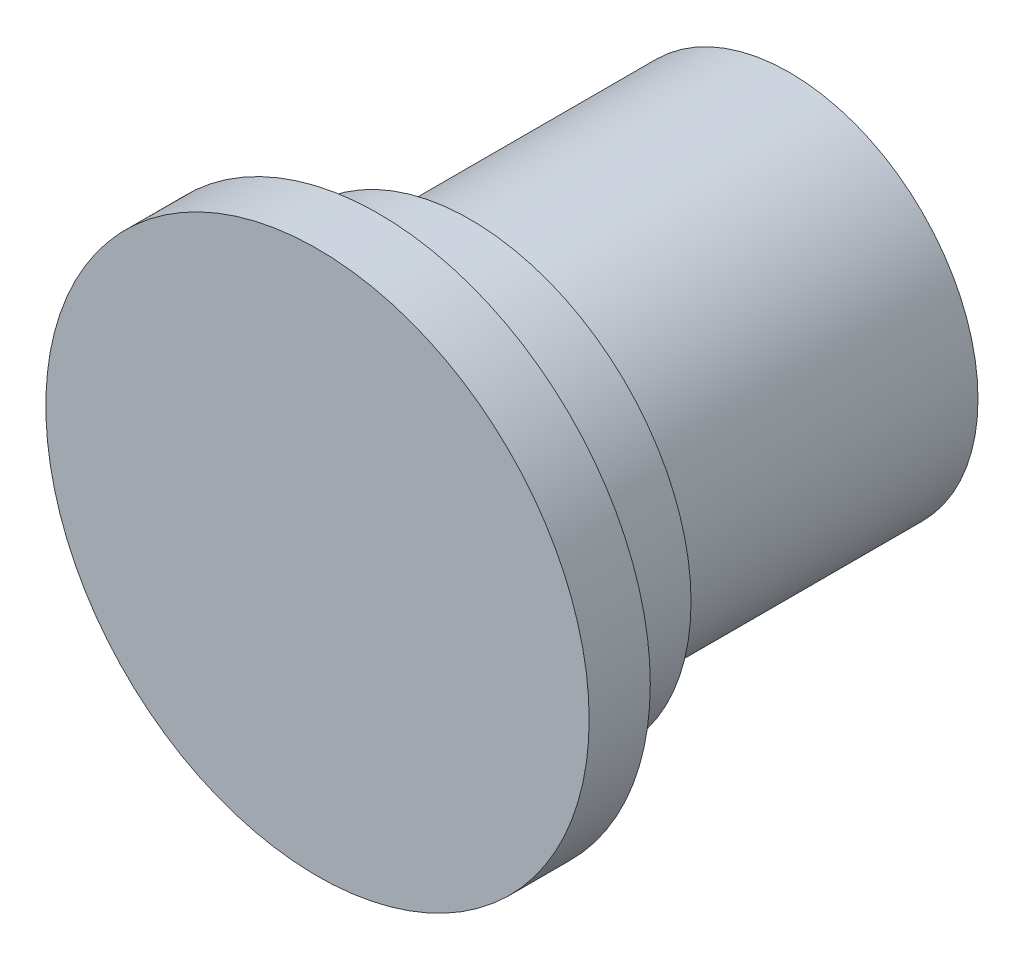
ISO-10303-21;
HEADER;
FILE_DESCRIPTION(('STEP AP214'),'2;1');
FILE_NAME('part.step','',(''),(''),'','','');
FILE_SCHEMA(('AUTOMOTIVE_DESIGN { 1 0 10303 214 1 1 1 1 }'));
ENDSEC;
DATA;
#1=APPLICATION_CONTEXT('core data for automotive mechanical design processes');
#2=APPLICATION_PROTOCOL_DEFINITION('international standard','automotive_design',2000,#1);
#3=PRODUCT_CONTEXT('',#1,'mechanical');
#4=PRODUCT('Part','Part','',(#3));
#5=PRODUCT_RELATED_PRODUCT_CATEGORY('part','',(#4));
#6=PRODUCT_DEFINITION_FORMATION('','',#4);
#7=PRODUCT_DEFINITION_CONTEXT('part definition',#1,'design');
#8=PRODUCT_DEFINITION('design','',#6,#7);
#9=PRODUCT_DEFINITION_SHAPE('','',#8);
#10=(LENGTH_UNIT() NAMED_UNIT(*) SI_UNIT(.MILLI.,.METRE.));
#11=(NAMED_UNIT(*) PLANE_ANGLE_UNIT() SI_UNIT($,.RADIAN.));
#12=(NAMED_UNIT(*) SI_UNIT($,.STERADIAN.) SOLID_ANGLE_UNIT());
#13=UNCERTAINTY_MEASURE_WITH_UNIT(LENGTH_MEASURE(1.E-05),#10,'distance_accuracy_value','');
#14=(GEOMETRIC_REPRESENTATION_CONTEXT(3) GLOBAL_UNCERTAINTY_ASSIGNED_CONTEXT((#13)) GLOBAL_UNIT_ASSIGNED_CONTEXT((#10,
#11,#12)) REPRESENTATION_CONTEXT('',''));
#15=CARTESIAN_POINT('',(0.,0.,0.));
#16=DIRECTION('',(0.,0.,1.));
#17=DIRECTION('',(1.,0.,0.));
#18=AXIS2_PLACEMENT_3D('',#15,#16,#17);
#19=CARTESIAN_POINT('',(0.,0.,-4.5));
#20=DIRECTION('',(0.,0.,-1.));
#21=DIRECTION('',(-1.,0.,0.));
#22=AXIS2_PLACEMENT_3D('',#19,#20,#21);
#23=PLANE('',#22);
#24=CARTESIAN_POINT('',(0.,0.,-4.5));
#25=DIRECTION('',(0.,0.,-1.));
#26=DIRECTION('',(-1.,0.,0.));
#27=AXIS2_PLACEMENT_3D('',#24,#25,#26);
#28=CIRCLE('',#27,6.5);
#29=CARTESIAN_POINT('',(6.5,0.,-4.5));
#30=VERTEX_POINT('',#29);
#31=EDGE_CURVE('E47',#30,#30,#28,.T.);
#32=ORIENTED_EDGE('',*,*,#31,.T.);
#33=EDGE_LOOP('',(#32));
#34=FACE_BOUND('',#33,.T.);
#35=CARTESIAN_POINT('',(0.,0.,-4.5));
#36=DIRECTION('',(0.,0.,-1.));
#37=DIRECTION('',(-1.,0.,0.));
#38=AXIS2_PLACEMENT_3D('',#35,#36,#37);
#39=CIRCLE('',#38,5.55);
#40=CARTESIAN_POINT('',(-5.55,0.,-4.5));
#41=VERTEX_POINT('',#40);
#42=EDGE_CURVE('E52',#41,#41,#39,.T.);
#43=ORIENTED_EDGE('',*,*,#42,.F.);
#44=EDGE_LOOP('',(#43));
#45=FACE_BOUND('',#44,.T.);
#46=ADVANCED_FACE('F31',(#34,#45),#23,.T.);
#47=CARTESIAN_POINT('',(0.,0.,-1.8));
#48=DIRECTION('',(0.,0.,1.));
#49=DIRECTION('',(1.,0.,0.));
#50=AXIS2_PLACEMENT_3D('',#47,#48,#49);
#51=PLANE('',#50);
#52=CARTESIAN_POINT('',(0.,0.,-1.8));
#53=DIRECTION('',(0.,0.,1.));
#54=DIRECTION('',(1.,0.,0.));
#55=AXIS2_PLACEMENT_3D('',#52,#53,#54);
#56=CIRCLE('',#55,8.);
#57=CARTESIAN_POINT('',(8.,0.,-1.8));
#58=VERTEX_POINT('',#57);
#59=EDGE_CURVE('E38',#58,#58,#56,.T.);
#60=ORIENTED_EDGE('',*,*,#59,.F.);
#61=EDGE_LOOP('',(#60));
#62=FACE_BOUND('',#61,.T.);
#63=CARTESIAN_POINT('',(0.,0.,-1.8));
#64=DIRECTION('',(0.,0.,1.));
#65=DIRECTION('',(1.,0.,0.));
#66=AXIS2_PLACEMENT_3D('',#63,#64,#65);
#67=CIRCLE('',#66,6.5);
#68=CARTESIAN_POINT('',(6.5,0.,-1.8));
#69=VERTEX_POINT('',#68);
#70=EDGE_CURVE('E10',#69,#69,#67,.F.);
#71=ORIENTED_EDGE('',*,*,#70,.F.);
#72=EDGE_LOOP('',(#71));
#73=FACE_BOUND('',#72,.T.);
#74=ADVANCED_FACE('F68',(#62,#73),#51,.F.);
#75=CARTESIAN_POINT('',(0.,0.,-1.8));
#76=DIRECTION('',(0.,0.,1.));
#77=DIRECTION('',(1.,0.,0.));
#78=AXIS2_PLACEMENT_3D('',#75,#76,#77);
#79=CYLINDRICAL_SURFACE('',#78,8.);
#80=ORIENTED_EDGE('',*,*,#59,.T.);
#81=EDGE_LOOP('',(#80));
#82=FACE_BOUND('',#81,.T.);
#83=CARTESIAN_POINT('',(0.,0.,0.));
#84=DIRECTION('',(0.,0.,1.));
#85=DIRECTION('',(1.,0.,0.));
#86=AXIS2_PLACEMENT_3D('',#83,#84,#85);
#87=CIRCLE('',#86,8.);
#88=CARTESIAN_POINT('',(8.,0.,0.));
#89=VERTEX_POINT('',#88);
#90=EDGE_CURVE('E42',#89,#89,#87,.T.);
#91=ORIENTED_EDGE('',*,*,#90,.F.);
#92=EDGE_LOOP('',(#91));
#93=FACE_BOUND('',#92,.T.);
#94=ADVANCED_FACE('F33',(#82,#93),#79,.T.);
#95=CARTESIAN_POINT('',(0.,0.,0.));
#96=DIRECTION('',(0.,0.,1.));
#97=DIRECTION('',(1.,0.,0.));
#98=AXIS2_PLACEMENT_3D('',#95,#96,#97);
#99=PLANE('',#98);
#100=ORIENTED_EDGE('',*,*,#90,.T.);
#101=EDGE_LOOP('',(#100));
#102=FACE_BOUND('',#101,.T.);
#103=ADVANCED_FACE('F79',(#102),#99,.T.);
#104=CARTESIAN_POINT('',(0.,0.,-4.5));
#105=DIRECTION('',(0.,0.,1.));
#106=DIRECTION('',(1.,0.,0.));
#107=AXIS2_PLACEMENT_3D('',#104,#105,#106);
#108=CYLINDRICAL_SURFACE('',#107,6.5);
#109=CARTESIAN_POINT('',(6.5,0.,-4.5));
#110=CARTESIAN_POINT('',(6.5,0.,-4.471875));
#111=CARTESIAN_POINT('',(6.5,0.,-4.44375));
#112=CARTESIAN_POINT('',(6.5,0.,-4.3875));
#113=CARTESIAN_POINT('',(6.5,0.,-4.359375));
#114=CARTESIAN_POINT('',(6.5,0.,-4.303125));
#115=CARTESIAN_POINT('',(6.5,0.,-4.275));
#116=CARTESIAN_POINT('',(6.5,0.,-4.21875));
#117=CARTESIAN_POINT('',(6.5,0.,-4.190625));
#118=CARTESIAN_POINT('',(6.5,0.,-4.134375));
#119=CARTESIAN_POINT('',(6.5,0.,-4.10625));
#120=CARTESIAN_POINT('',(6.5,0.,-4.05));
#121=CARTESIAN_POINT('',(6.5,0.,-4.021875));
#122=CARTESIAN_POINT('',(6.5,0.,-3.965625));
#123=CARTESIAN_POINT('',(6.5,0.,-3.9375));
#124=CARTESIAN_POINT('',(6.5,0.,-3.88125));
#125=CARTESIAN_POINT('',(6.5,0.,-3.853125));
#126=CARTESIAN_POINT('',(6.5,0.,-3.796875));
#127=CARTESIAN_POINT('',(6.5,0.,-3.76875));
#128=CARTESIAN_POINT('',(6.5,0.,-3.7125));
#129=CARTESIAN_POINT('',(6.5,0.,-3.684375));
#130=CARTESIAN_POINT('',(6.5,0.,-3.628125));
#131=CARTESIAN_POINT('',(6.5,0.,-3.6));
#132=CARTESIAN_POINT('',(6.5,0.,-3.54375));
#133=CARTESIAN_POINT('',(6.5,0.,-3.515625));
#134=CARTESIAN_POINT('',(6.5,0.,-3.459375));
#135=CARTESIAN_POINT('',(6.5,0.,-3.43125));
#136=CARTESIAN_POINT('',(6.5,0.,-3.375));
#137=CARTESIAN_POINT('',(6.5,0.,-3.346875));
#138=CARTESIAN_POINT('',(6.5,0.,-3.290625));
#139=CARTESIAN_POINT('',(6.5,0.,-3.2625));
#140=CARTESIAN_POINT('',(6.5,0.,-3.20625));
#141=CARTESIAN_POINT('',(6.5,0.,-3.178125));
#142=CARTESIAN_POINT('',(6.5,0.,-3.121875));
#143=CARTESIAN_POINT('',(6.5,0.,-3.09375));
#144=CARTESIAN_POINT('',(6.5,0.,-3.0375));
#145=CARTESIAN_POINT('',(6.5,0.,-3.009375));
#146=CARTESIAN_POINT('',(6.5,0.,-2.953125));
#147=CARTESIAN_POINT('',(6.5,0.,-2.925));
#148=CARTESIAN_POINT('',(6.5,0.,-2.86875));
#149=CARTESIAN_POINT('',(6.5,0.,-2.840625));
#150=CARTESIAN_POINT('',(6.5,0.,-2.784375));
#151=CARTESIAN_POINT('',(6.5,0.,-2.75625));
#152=CARTESIAN_POINT('',(6.5,0.,-2.7));
#153=CARTESIAN_POINT('',(6.5,0.,-2.671875));
#154=CARTESIAN_POINT('',(6.5,0.,-2.615625));
#155=CARTESIAN_POINT('',(6.5,0.,-2.5875));
#156=CARTESIAN_POINT('',(6.5,0.,-2.53125));
#157=CARTESIAN_POINT('',(6.5,0.,-2.503125));
#158=CARTESIAN_POINT('',(6.5,0.,-2.446875));
#159=CARTESIAN_POINT('',(6.5,0.,-2.41875));
#160=CARTESIAN_POINT('',(6.5,0.,-2.3625));
#161=CARTESIAN_POINT('',(6.5,0.,-2.334375));
#162=CARTESIAN_POINT('',(6.5,0.,-2.278125));
#163=CARTESIAN_POINT('',(6.5,0.,-2.25));
#164=CARTESIAN_POINT('',(6.5,0.,-2.19375));
#165=CARTESIAN_POINT('',(6.5,0.,-2.165625));
#166=CARTESIAN_POINT('',(6.5,0.,-2.109375));
#167=CARTESIAN_POINT('',(6.5,0.,-2.08125));
#168=CARTESIAN_POINT('',(6.5,0.,-2.025));
#169=CARTESIAN_POINT('',(6.5,0.,-1.996875));
#170=CARTESIAN_POINT('',(6.5,0.,-1.940625));
#171=CARTESIAN_POINT('',(6.5,0.,-1.9125));
#172=CARTESIAN_POINT('',(6.5,0.,-1.85625));
#173=CARTESIAN_POINT('',(6.5,0.,-1.828125));
#174=CARTESIAN_POINT('',(6.5,0.,-1.8));
#175=B_SPLINE_CURVE_WITH_KNOTS('',3,(#109,#110,#111,#112,#113,#114,#115,#116,#117,#118,#119,
#120,#121,#122,#123,#124,#125,#126,#127,#128,#129,#130,#131,#132,#133,#134,#135,#136,#137,#138,
#139,#140,#141,#142,#143,#144,#145,#146,#147,#148,#149,#150,#151,#152,#153,#154,#155,#156,#157,
#158,#159,#160,#161,#162,#163,#164,#165,#166,#167,#168,#169,#170,#171,#172,#173,#174),
.UNSPECIFIED.,.F.,.F.,(4,2,2,2,2,2,2,2,2,2,2,2,2,2,2,2,2,2,2,2,2,2,2,2,2,2,2,2,2,2,2,2,4),(0.,
0.0843749999999994,0.16875,0.253125,0.337499999999999,0.421875,0.50625,0.590625,
0.674999999999999,0.759375,0.84375,0.928125,1.0125,1.096875,1.18125,1.265625,1.35,1.434375,
1.51875,1.603125,1.6875,1.771875,1.85625,1.940625,2.025,2.109375,2.19375,2.278125,2.3625,
2.446875,2.53125,2.615625,2.7),.UNSPECIFIED.);
#176=EDGE_CURVE('BSEAM63',#30,#69,#175,.T.);
#177=ORIENTED_EDGE('',*,*,#31,.F.);
#178=ORIENTED_EDGE('',*,*,#70,.T.);
#179=ORIENTED_EDGE('',*,*,#176,.T.);
#180=ORIENTED_EDGE('',*,*,#176,.F.);
#181=EDGE_LOOP('',(#177,#179,#178,#180));
#182=FACE_BOUND('',#181,.T.);
#183=ADVANCED_FACE('F63',(#182),#108,.T.);
#184=CARTESIAN_POINT('',(0.,0.,-13.9));
#185=DIRECTION('',(0.,0.,1.));
#186=DIRECTION('',(1.,0.,0.));
#187=AXIS2_PLACEMENT_3D('',#184,#185,#186);
#188=CYLINDRICAL_SURFACE('',#187,5.55);
#189=CARTESIAN_POINT('',(0.,0.,-13.9));
#190=DIRECTION('',(0.,0.,-1.));
#191=DIRECTION('',(-1.,0.,0.));
#192=AXIS2_PLACEMENT_3D('',#189,#190,#191);
#193=CIRCLE('',#192,5.55);
#194=CARTESIAN_POINT('',(-5.55,0.,-13.9));
#195=VERTEX_POINT('',#194);
#196=EDGE_CURVE('E51',#195,#195,#193,.T.);
#197=ORIENTED_EDGE('',*,*,#196,.F.);
#198=EDGE_LOOP('',(#197));
#199=FACE_BOUND('',#198,.T.);
#200=ORIENTED_EDGE('',*,*,#42,.T.);
#201=EDGE_LOOP('',(#200));
#202=FACE_BOUND('',#201,.T.);
#203=ADVANCED_FACE('F60',(#199,#202),#188,.T.);
#204=CARTESIAN_POINT('',(0.,0.,-13.9));
#205=DIRECTION('',(0.,0.,-1.));
#206=DIRECTION('',(-1.,0.,0.));
#207=AXIS2_PLACEMENT_3D('',#204,#205,#206);
#208=PLANE('',#207);
#209=ORIENTED_EDGE('',*,*,#196,.T.);
#210=EDGE_LOOP('',(#209));
#211=FACE_BOUND('',#210,.T.);
#212=ADVANCED_FACE('F58',(#211),#208,.T.);
#213=CLOSED_SHELL('',(#46,#74,#94,#103,#183,#203,#212));
#214=MANIFOLD_SOLID_BREP('B2',#213);
#215=ADVANCED_BREP_SHAPE_REPRESENTATION('',(#18,#214),#14);
#216=SHAPE_DEFINITION_REPRESENTATION(#9,#215);
ENDSEC;
END-ISO-10303-21;
